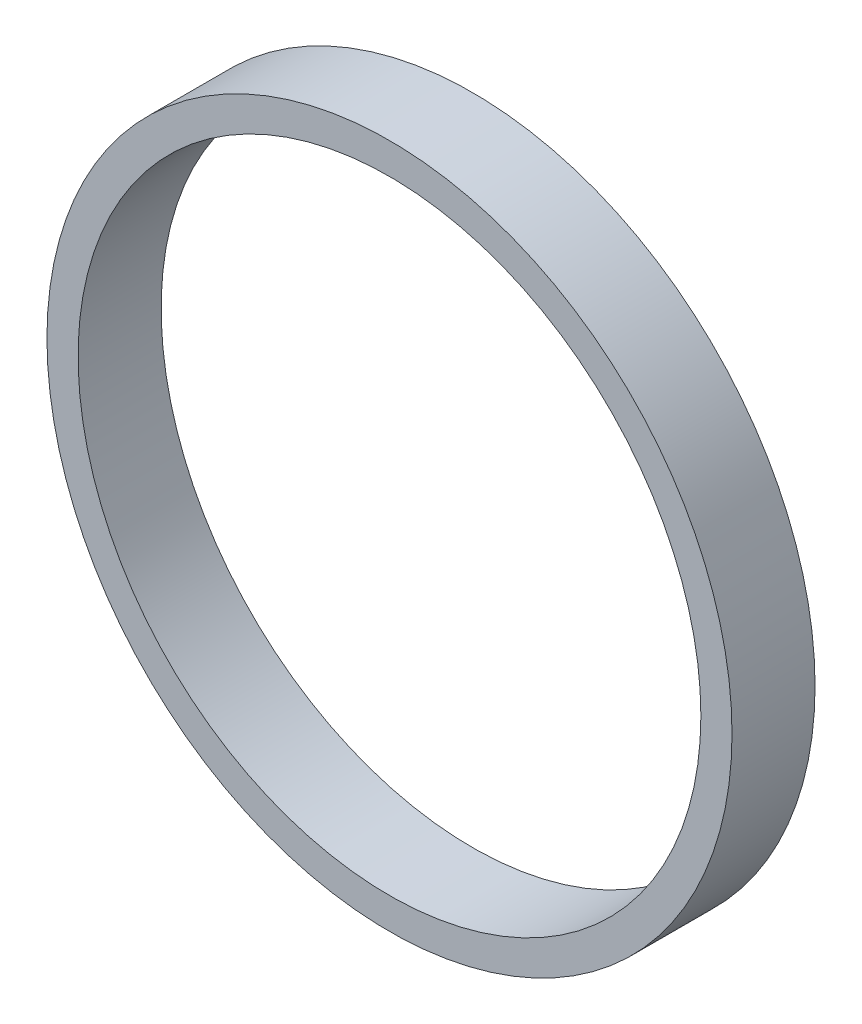
ISO-10303-21;
HEADER;
FILE_DESCRIPTION(('STEP AP214'),'2;1');
FILE_NAME('part.step','',(''),(''),'','','');
FILE_SCHEMA(('AUTOMOTIVE_DESIGN { 1 0 10303 214 1 1 1 1 }'));
ENDSEC;
DATA;
#1=APPLICATION_CONTEXT('core data for automotive mechanical design processes');
#2=APPLICATION_PROTOCOL_DEFINITION('international standard','automotive_design',2000,#1);
#3=PRODUCT_CONTEXT('',#1,'mechanical');
#4=PRODUCT('Part','Part','',(#3));
#5=PRODUCT_RELATED_PRODUCT_CATEGORY('part','',(#4));
#6=PRODUCT_DEFINITION_FORMATION('','',#4);
#7=PRODUCT_DEFINITION_CONTEXT('part definition',#1,'design');
#8=PRODUCT_DEFINITION('design','',#6,#7);
#9=PRODUCT_DEFINITION_SHAPE('','',#8);
#10=(LENGTH_UNIT() NAMED_UNIT(*) SI_UNIT(.MILLI.,.METRE.));
#11=(NAMED_UNIT(*) PLANE_ANGLE_UNIT() SI_UNIT($,.RADIAN.));
#12=(NAMED_UNIT(*) SI_UNIT($,.STERADIAN.) SOLID_ANGLE_UNIT());
#13=UNCERTAINTY_MEASURE_WITH_UNIT(LENGTH_MEASURE(1.E-05),#10,'distance_accuracy_value','');
#14=(GEOMETRIC_REPRESENTATION_CONTEXT(3) GLOBAL_UNCERTAINTY_ASSIGNED_CONTEXT((#13)) GLOBAL_UNIT_ASSIGNED_CONTEXT((#10,
#11,#12)) REPRESENTATION_CONTEXT('',''));
#15=CARTESIAN_POINT('',(0.,0.,0.));
#16=DIRECTION('',(0.,0.,1.));
#17=DIRECTION('',(1.,0.,0.));
#18=AXIS2_PLACEMENT_3D('',#15,#16,#17);
#19=CARTESIAN_POINT('',(0.,0.,4.));
#20=DIRECTION('',(0.,0.,1.));
#21=DIRECTION('',(1.,0.,0.));
#22=AXIS2_PLACEMENT_3D('',#19,#20,#21);
#23=PLANE('',#22);
#24=CARTESIAN_POINT('',(0.,0.,4.));
#25=DIRECTION('',(0.,0.,1.));
#26=DIRECTION('',(1.,0.,0.));
#27=AXIS2_PLACEMENT_3D('',#24,#25,#26);
#28=CIRCLE('',#27,16.5);
#29=CARTESIAN_POINT('',(16.5,0.,4.));
#30=VERTEX_POINT('',#29);
#31=EDGE_CURVE('E10',#30,#30,#28,.T.);
#32=ORIENTED_EDGE('',*,*,#31,.T.);
#33=EDGE_LOOP('',(#32));
#34=FACE_BOUND('',#33,.T.);
#35=CARTESIAN_POINT('',(0.,0.,4.));
#36=DIRECTION('',(0.,0.,1.));
#37=DIRECTION('',(1.,0.,0.));
#38=AXIS2_PLACEMENT_3D('',#35,#36,#37);
#39=CIRCLE('',#38,15.);
#40=CARTESIAN_POINT('',(15.,0.,4.));
#41=VERTEX_POINT('',#40);
#42=EDGE_CURVE('E50',#41,#41,#39,.T.);
#43=ORIENTED_EDGE('',*,*,#42,.F.);
#44=EDGE_LOOP('',(#43));
#45=FACE_BOUND('',#44,.T.);
#46=ADVANCED_FACE('F37',(#34,#45),#23,.T.);
#47=CARTESIAN_POINT('',(0.,0.,0.));
#48=DIRECTION('',(0.,0.,1.));
#49=DIRECTION('',(1.,0.,0.));
#50=AXIS2_PLACEMENT_3D('',#47,#48,#49);
#51=PLANE('',#50);
#52=CARTESIAN_POINT('',(0.,0.,0.));
#53=DIRECTION('',(0.,0.,1.));
#54=DIRECTION('',(1.,0.,0.));
#55=AXIS2_PLACEMENT_3D('',#52,#53,#54);
#56=CIRCLE('',#55,16.5);
#57=CARTESIAN_POINT('',(16.5,0.,0.));
#58=VERTEX_POINT('',#57);
#59=EDGE_CURVE('E41',#58,#58,#56,.T.);
#60=ORIENTED_EDGE('',*,*,#59,.F.);
#61=EDGE_LOOP('',(#60));
#62=FACE_BOUND('',#61,.T.);
#63=CARTESIAN_POINT('',(0.,0.,0.));
#64=DIRECTION('',(0.,0.,1.));
#65=DIRECTION('',(1.,0.,0.));
#66=AXIS2_PLACEMENT_3D('',#63,#64,#65);
#67=CIRCLE('',#66,15.);
#68=CARTESIAN_POINT('',(15.,0.,0.));
#69=VERTEX_POINT('',#68);
#70=EDGE_CURVE('E52',#69,#69,#67,.T.);
#71=ORIENTED_EDGE('',*,*,#70,.T.);
#72=EDGE_LOOP('',(#71));
#73=FACE_BOUND('',#72,.T.);
#74=ADVANCED_FACE('F64',(#62,#73),#51,.F.);
#75=CARTESIAN_POINT('',(0.,0.,4.));
#76=DIRECTION('',(0.,0.,-1.));
#77=DIRECTION('',(-1.,0.,0.));
#78=AXIS2_PLACEMENT_3D('',#75,#76,#77);
#79=CYLINDRICAL_SURFACE('',#78,16.5);
#80=ORIENTED_EDGE('',*,*,#31,.F.);
#81=EDGE_LOOP('',(#80));
#82=FACE_BOUND('',#81,.T.);
#83=ORIENTED_EDGE('',*,*,#59,.T.);
#84=EDGE_LOOP('',(#83));
#85=FACE_BOUND('',#84,.T.);
#86=ADVANCED_FACE('F39',(#82,#85),#79,.T.);
#87=CARTESIAN_POINT('',(0.,0.,4.));
#88=DIRECTION('',(0.,0.,-1.));
#89=DIRECTION('',(-1.,0.,0.));
#90=AXIS2_PLACEMENT_3D('',#87,#88,#89);
#91=CYLINDRICAL_SURFACE('',#90,15.);
#92=ORIENTED_EDGE('',*,*,#42,.T.);
#93=EDGE_LOOP('',(#92));
#94=FACE_BOUND('',#93,.T.);
#95=ORIENTED_EDGE('',*,*,#70,.F.);
#96=EDGE_LOOP('',(#95));
#97=FACE_BOUND('',#96,.T.);
#98=ADVANCED_FACE('F60',(#94,#97),#91,.F.);
#99=CLOSED_SHELL('',(#46,#74,#86,#98));
#100=MANIFOLD_SOLID_BREP('B2',#99);
#101=ADVANCED_BREP_SHAPE_REPRESENTATION('',(#18,#100),#14);
#102=SHAPE_DEFINITION_REPRESENTATION(#9,#101);
ENDSEC;
END-ISO-10303-21;
